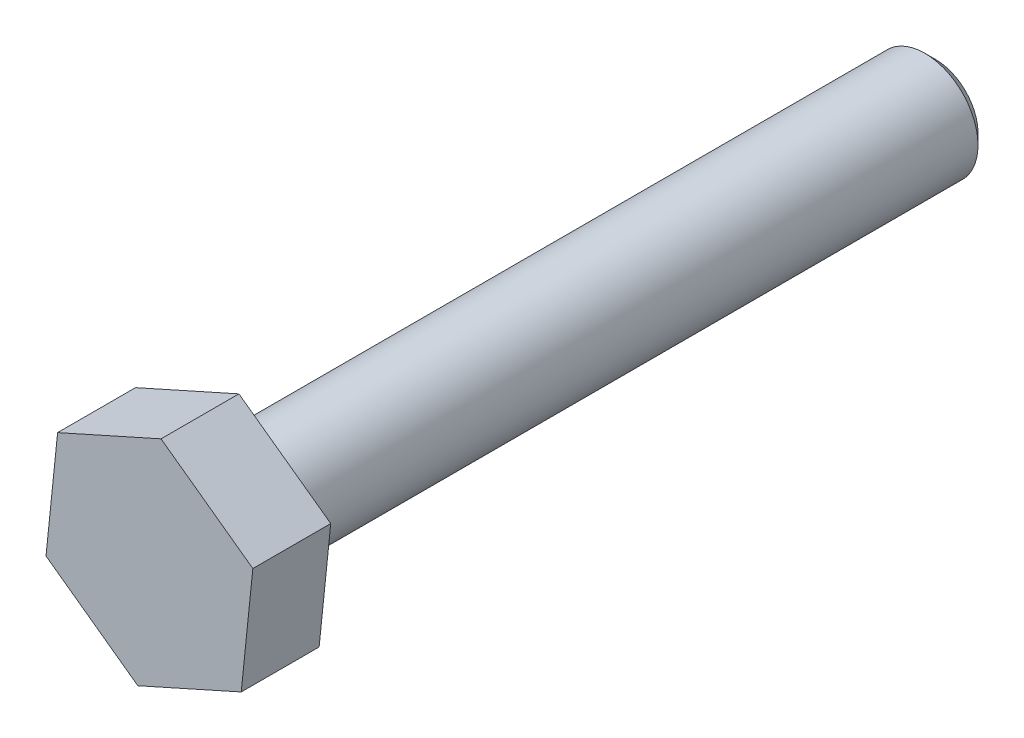
ISO-10303-21;
HEADER;
FILE_DESCRIPTION(('STEP AP214'),'2;1');
FILE_NAME('part.step','',(''),(''),'','','');
FILE_SCHEMA(('AUTOMOTIVE_DESIGN { 1 0 10303 214 1 1 1 1 }'));
ENDSEC;
DATA;
#1=APPLICATION_CONTEXT('core data for automotive mechanical design processes');
#2=APPLICATION_PROTOCOL_DEFINITION('international standard','automotive_design',2000,#1);
#3=PRODUCT_CONTEXT('',#1,'mechanical');
#4=PRODUCT('Part','Part','',(#3));
#5=PRODUCT_RELATED_PRODUCT_CATEGORY('part','',(#4));
#6=PRODUCT_DEFINITION_FORMATION('','',#4);
#7=PRODUCT_DEFINITION_CONTEXT('part definition',#1,'design');
#8=PRODUCT_DEFINITION('design','',#6,#7);
#9=PRODUCT_DEFINITION_SHAPE('','',#8);
#10=(LENGTH_UNIT() NAMED_UNIT(*) SI_UNIT(.MILLI.,.METRE.));
#11=(NAMED_UNIT(*) PLANE_ANGLE_UNIT() SI_UNIT($,.RADIAN.));
#12=(NAMED_UNIT(*) SI_UNIT($,.STERADIAN.) SOLID_ANGLE_UNIT());
#13=UNCERTAINTY_MEASURE_WITH_UNIT(LENGTH_MEASURE(1.E-05),#10,'distance_accuracy_value','');
#14=(GEOMETRIC_REPRESENTATION_CONTEXT(3) GLOBAL_UNCERTAINTY_ASSIGNED_CONTEXT((#13)) GLOBAL_UNIT_ASSIGNED_CONTEXT((#10,
#11,#12)) REPRESENTATION_CONTEXT('',''));
#15=CARTESIAN_POINT('',(0.,0.,0.));
#16=DIRECTION('',(0.,0.,1.));
#17=DIRECTION('',(1.,0.,0.));
#18=AXIS2_PLACEMENT_3D('',#15,#16,#17);
#19=CARTESIAN_POINT('',(0.,0.,0.));
#20=DIRECTION('',(0.,0.,1.));
#21=DIRECTION('',(1.,0.,0.));
#22=AXIS2_PLACEMENT_3D('',#19,#20,#21);
#23=PLANE('',#22);
#24=DIRECTION('',(0.912698102583248,0.408634523187822,0.));
#25=VECTOR('',#24,1.);
#26=CARTESIAN_POINT('',(-0.327875754712407,-3.18315841413395,0.));
#27=LINE('',#26,#25);
#28=CARTESIAN_POINT('',(-0.327875754712407,-3.18315841413395,0.));
#29=VERTEX_POINT('',#28);
#30=CARTESIAN_POINT('',(2.59275817355398,-1.87552793993292,0.));
#31=VERTEX_POINT('',#30);
#32=EDGE_CURVE('E124',#29,#31,#27,.T.);
#33=ORIENTED_EDGE('',*,*,#32,.F.);
#34=DIRECTION('',(0.810236929235619,-0.586102481229038,0.));
#35=VECTOR('',#34,1.);
#36=CARTESIAN_POINT('',(-2.92063392826639,-1.30763047420103,0.));
#37=LINE('',#36,#35);
#38=CARTESIAN_POINT('',(-2.92063392826639,-1.30763047420103,0.));
#39=VERTEX_POINT('',#38);
#40=EDGE_CURVE('E84',#39,#29,#37,.T.);
#41=ORIENTED_EDGE('',*,*,#40,.F.);
#42=DIRECTION('',(-0.102461173347629,-0.99473700441686,0.));
#43=VECTOR('',#42,1.);
#44=CARTESIAN_POINT('',(-2.59275817355398,1.87552793993292,0.));
#45=LINE('',#44,#43);
#46=CARTESIAN_POINT('',(-2.59275817355398,1.87552793993292,0.));
#47=VERTEX_POINT('',#46);
#48=EDGE_CURVE('E78',#47,#39,#45,.T.);
#49=ORIENTED_EDGE('',*,*,#48,.F.);
#50=DIRECTION('',(-0.912698102583248,-0.408634523187822,0.));
#51=VECTOR('',#50,1.);
#52=CARTESIAN_POINT('',(0.327875754712414,3.18315841413395,0.));
#53=LINE('',#52,#51);
#54=CARTESIAN_POINT('',(0.327875754712414,3.18315841413395,0.));
#55=VERTEX_POINT('',#54);
#56=EDGE_CURVE('E114',#55,#47,#53,.T.);
#57=ORIENTED_EDGE('',*,*,#56,.F.);
#58=DIRECTION('',(-0.810236929235619,0.586102481229037,0.));
#59=VECTOR('',#58,1.);
#60=CARTESIAN_POINT('',(2.92063392826639,1.30763047420103,0.));
#61=LINE('',#60,#59);
#62=CARTESIAN_POINT('',(2.92063392826639,1.30763047420103,0.));
#63=VERTEX_POINT('',#62);
#64=EDGE_CURVE('E129',#63,#55,#61,.T.);
#65=ORIENTED_EDGE('',*,*,#64,.F.);
#66=DIRECTION('',(0.102461173347629,0.99473700441686,0.));
#67=VECTOR('',#66,1.);
#68=CARTESIAN_POINT('',(2.59275817355398,-1.87552793993292,0.));
#69=LINE('',#68,#67);
#70=EDGE_CURVE('E127',#31,#63,#69,.T.);
#71=ORIENTED_EDGE('',*,*,#70,.F.);
#72=EDGE_LOOP('',(#33,#41,#49,#57,#65,#71));
#73=FACE_BOUND('',#72,.T.);
#74=CARTESIAN_POINT('',(0.,0.,0.));
#75=DIRECTION('',(0.,0.,1.));
#76=DIRECTION('',(1.,0.,0.));
#77=AXIS2_PLACEMENT_3D('',#74,#75,#76);
#78=CIRCLE('',#77,1.5);
#79=CARTESIAN_POINT('',(1.5,0.,0.));
#80=VERTEX_POINT('',#79);
#81=EDGE_CURVE('E143',#80,#80,#78,.F.);
#82=ORIENTED_EDGE('',*,*,#81,.F.);
#83=EDGE_LOOP('',(#82));
#84=FACE_BOUND('',#83,.T.);
#85=ADVANCED_FACE('F38',(#73,#84),#23,.F.);
#86=CARTESIAN_POINT('',(-0.327875754712407,-3.18315841413395,2.2));
#87=DIRECTION('',(-0.408634523187822,0.912698102583248,0.));
#88=DIRECTION('',(-0.912698102583248,-0.408634523187822,0.));
#89=AXIS2_PLACEMENT_3D('',#86,#87,#88);
#90=PLANE('',#89);
#91=ORIENTED_EDGE('',*,*,#32,.T.);
#92=DIRECTION('',(0.,0.,-1.));
#93=VECTOR('',#92,1.);
#94=CARTESIAN_POINT('',(2.59275817355398,-1.87552793993292,2.2));
#95=LINE('',#94,#93);
#96=CARTESIAN_POINT('',(2.59275817355398,-1.87552793993292,2.2));
#97=VERTEX_POINT('',#96);
#98=EDGE_CURVE('E141',#97,#31,#95,.T.);
#99=ORIENTED_EDGE('',*,*,#98,.F.);
#100=DIRECTION('',(0.912698102583248,0.408634523187822,0.));
#101=VECTOR('',#100,1.);
#102=CARTESIAN_POINT('',(-0.327875754712407,-3.18315841413395,2.2));
#103=LINE('',#102,#101);
#104=CARTESIAN_POINT('',(-0.327875754712407,-3.18315841413395,2.2));
#105=VERTEX_POINT('',#104);
#106=EDGE_CURVE('E134',#105,#97,#103,.T.);
#107=ORIENTED_EDGE('',*,*,#106,.F.);
#108=DIRECTION('',(0.,0.,-1.));
#109=VECTOR('',#108,1.);
#110=CARTESIAN_POINT('',(-0.327875754712407,-3.18315841413395,2.2));
#111=LINE('',#110,#109);
#112=EDGE_CURVE('E120',#105,#29,#111,.T.);
#113=ORIENTED_EDGE('',*,*,#112,.T.);
#114=EDGE_LOOP('',(#91,#99,#107,#113));
#115=FACE_BOUND('',#114,.T.);
#116=ADVANCED_FACE('F159',(#115),#90,.F.);
#117=CARTESIAN_POINT('',(2.59275817355398,-1.87552793993292,2.2));
#118=DIRECTION('',(-0.994737004416859,0.102461173347629,0.));
#119=DIRECTION('',(-0.102461173347629,-0.99473700441686,0.));
#120=AXIS2_PLACEMENT_3D('',#117,#118,#119);
#121=PLANE('',#120);
#122=ORIENTED_EDGE('',*,*,#70,.T.);
#123=DIRECTION('',(0.,0.,-1.));
#124=VECTOR('',#123,1.);
#125=CARTESIAN_POINT('',(2.92063392826639,1.30763047420103,2.2));
#126=LINE('',#125,#124);
#127=CARTESIAN_POINT('',(2.92063392826639,1.30763047420103,2.2));
#128=VERTEX_POINT('',#127);
#129=EDGE_CURVE('E138',#128,#63,#126,.T.);
#130=ORIENTED_EDGE('',*,*,#129,.F.);
#131=DIRECTION('',(0.102461173347629,0.99473700441686,0.));
#132=VECTOR('',#131,1.);
#133=CARTESIAN_POINT('',(2.59275817355398,-1.87552793993292,2.2));
#134=LINE('',#133,#132);
#135=EDGE_CURVE('E93',#97,#128,#134,.T.);
#136=ORIENTED_EDGE('',*,*,#135,.F.);
#137=ORIENTED_EDGE('',*,*,#98,.T.);
#138=EDGE_LOOP('',(#122,#130,#136,#137));
#139=FACE_BOUND('',#138,.T.);
#140=ADVANCED_FACE('F165',(#139),#121,.F.);
#141=CARTESIAN_POINT('',(2.92063392826639,1.30763047420103,2.2));
#142=DIRECTION('',(-0.586102481229037,-0.810236929235619,0.));
#143=DIRECTION('',(0.81023692923562,-0.586102481229037,0.));
#144=AXIS2_PLACEMENT_3D('',#141,#142,#143);
#145=PLANE('',#144);
#146=ORIENTED_EDGE('',*,*,#64,.T.);
#147=DIRECTION('',(0.,0.,-1.));
#148=VECTOR('',#147,1.);
#149=CARTESIAN_POINT('',(0.327875754712414,3.18315841413395,2.2));
#150=LINE('',#149,#148);
#151=CARTESIAN_POINT('',(0.327875754712414,3.18315841413395,2.2));
#152=VERTEX_POINT('',#151);
#153=EDGE_CURVE('E115',#152,#55,#150,.T.);
#154=ORIENTED_EDGE('',*,*,#153,.F.);
#155=DIRECTION('',(-0.810236929235619,0.586102481229037,0.));
#156=VECTOR('',#155,1.);
#157=CARTESIAN_POINT('',(2.92063392826639,1.30763047420103,2.2));
#158=LINE('',#157,#156);
#159=EDGE_CURVE('E106',#128,#152,#158,.T.);
#160=ORIENTED_EDGE('',*,*,#159,.F.);
#161=ORIENTED_EDGE('',*,*,#129,.T.);
#162=EDGE_LOOP('',(#146,#154,#160,#161));
#163=FACE_BOUND('',#162,.T.);
#164=ADVANCED_FACE('F179',(#163),#145,.F.);
#165=CARTESIAN_POINT('',(0.327875754712414,3.18315841413395,2.2));
#166=DIRECTION('',(0.408634523187822,-0.912698102583248,0.));
#167=DIRECTION('',(0.912698102583248,0.408634523187822,0.));
#168=AXIS2_PLACEMENT_3D('',#165,#166,#167);
#169=PLANE('',#168);
#170=ORIENTED_EDGE('',*,*,#56,.T.);
#171=DIRECTION('',(0.,0.,-1.));
#172=VECTOR('',#171,1.);
#173=CARTESIAN_POINT('',(-2.59275817355398,1.87552793993292,2.2));
#174=LINE('',#173,#172);
#175=CARTESIAN_POINT('',(-2.59275817355398,1.87552793993292,2.2));
#176=VERTEX_POINT('',#175);
#177=EDGE_CURVE('E111',#176,#47,#174,.T.);
#178=ORIENTED_EDGE('',*,*,#177,.F.);
#179=DIRECTION('',(-0.912698102583248,-0.408634523187822,0.));
#180=VECTOR('',#179,1.);
#181=CARTESIAN_POINT('',(0.327875754712414,3.18315841413395,2.2));
#182=LINE('',#181,#180);
#183=EDGE_CURVE('E100',#152,#176,#182,.T.);
#184=ORIENTED_EDGE('',*,*,#183,.F.);
#185=ORIENTED_EDGE('',*,*,#153,.T.);
#186=EDGE_LOOP('',(#170,#178,#184,#185));
#187=FACE_BOUND('',#186,.T.);
#188=ADVANCED_FACE('F112',(#187),#169,.F.);
#189=CARTESIAN_POINT('',(-2.59275817355398,1.87552793993292,2.2));
#190=DIRECTION('',(0.994737004416859,-0.102461173347629,0.));
#191=DIRECTION('',(0.102461173347629,0.99473700441686,0.));
#192=AXIS2_PLACEMENT_3D('',#189,#190,#191);
#193=PLANE('',#192);
#194=ORIENTED_EDGE('',*,*,#48,.T.);
#195=DIRECTION('',(0.,0.,-1.));
#196=VECTOR('',#195,1.);
#197=CARTESIAN_POINT('',(-2.92063392826639,-1.30763047420103,2.2));
#198=LINE('',#197,#196);
#199=CARTESIAN_POINT('',(-2.92063392826639,-1.30763047420103,2.2));
#200=VERTEX_POINT('',#199);
#201=EDGE_CURVE('E116',#200,#39,#198,.T.);
#202=ORIENTED_EDGE('',*,*,#201,.F.);
#203=DIRECTION('',(-0.102461173347629,-0.99473700441686,0.));
#204=VECTOR('',#203,1.);
#205=CARTESIAN_POINT('',(-2.59275817355398,1.87552793993292,2.2));
#206=LINE('',#205,#204);
#207=EDGE_CURVE('E104',#176,#200,#206,.T.);
#208=ORIENTED_EDGE('',*,*,#207,.F.);
#209=ORIENTED_EDGE('',*,*,#177,.T.);
#210=EDGE_LOOP('',(#194,#202,#208,#209));
#211=FACE_BOUND('',#210,.T.);
#212=ADVANCED_FACE('F118',(#211),#193,.F.);
#213=CARTESIAN_POINT('',(-2.92063392826639,-1.30763047420103,2.2));
#214=DIRECTION('',(0.586102481229038,0.810236929235619,0.));
#215=DIRECTION('',(-0.810236929235619,0.586102481229038,0.));
#216=AXIS2_PLACEMENT_3D('',#213,#214,#215);
#217=PLANE('',#216);
#218=ORIENTED_EDGE('',*,*,#40,.T.);
#219=ORIENTED_EDGE('',*,*,#112,.F.);
#220=DIRECTION('',(0.810236929235619,-0.586102481229038,0.));
#221=VECTOR('',#220,1.);
#222=CARTESIAN_POINT('',(-2.92063392826639,-1.30763047420103,2.2));
#223=LINE('',#222,#221);
#224=EDGE_CURVE('E55',#200,#105,#223,.T.);
#225=ORIENTED_EDGE('',*,*,#224,.F.);
#226=ORIENTED_EDGE('',*,*,#201,.T.);
#227=EDGE_LOOP('',(#218,#219,#225,#226));
#228=FACE_BOUND('',#227,.T.);
#229=ADVANCED_FACE('F172',(#228),#217,.F.);
#230=CARTESIAN_POINT('',(0.,0.,2.2));
#231=DIRECTION('',(0.,0.,1.));
#232=DIRECTION('',(1.,0.,0.));
#233=AXIS2_PLACEMENT_3D('',#230,#231,#232);
#234=PLANE('',#233);
#235=ORIENTED_EDGE('',*,*,#106,.T.);
#236=ORIENTED_EDGE('',*,*,#135,.T.);
#237=ORIENTED_EDGE('',*,*,#159,.T.);
#238=ORIENTED_EDGE('',*,*,#183,.T.);
#239=ORIENTED_EDGE('',*,*,#207,.T.);
#240=ORIENTED_EDGE('',*,*,#224,.T.);
#241=EDGE_LOOP('',(#235,#236,#237,#238,#239,#240));
#242=FACE_BOUND('',#241,.T.);
#243=ADVANCED_FACE('F102',(#242),#234,.T.);
#244=CARTESIAN_POINT('',(0.,0.,-20.));
#245=DIRECTION('',(0.,0.,1.));
#246=DIRECTION('',(1.,0.,0.));
#247=AXIS2_PLACEMENT_3D('',#244,#245,#246);
#248=CYLINDRICAL_SURFACE('',#247,1.5);
#249=CARTESIAN_POINT('',(0.,0.,-19.7));
#250=DIRECTION('',(0.,0.,-1.));
#251=DIRECTION('',(-1.,0.,0.));
#252=AXIS2_PLACEMENT_3D('',#249,#250,#251);
#253=CIRCLE('',#252,1.5);
#254=CARTESIAN_POINT('',(-1.5,0.,-19.7));
#255=VERTEX_POINT('',#254);
#256=EDGE_CURVE('E11',#255,#255,#253,.F.);
#257=ORIENTED_EDGE('',*,*,#256,.T.);
#258=EDGE_LOOP('',(#257));
#259=FACE_BOUND('',#258,.T.);
#260=ORIENTED_EDGE('',*,*,#81,.T.);
#261=EDGE_LOOP('',(#260));
#262=FACE_BOUND('',#261,.T.);
#263=ADVANCED_FACE('F155',(#259,#262),#248,.T.);
#264=CARTESIAN_POINT('',(0.,0.,-20.));
#265=DIRECTION('',(0.,0.,-1.));
#266=DIRECTION('',(-1.,0.,0.));
#267=AXIS2_PLACEMENT_3D('',#264,#265,#266);
#268=PLANE('',#267);
#269=CARTESIAN_POINT('',(0.,0.,-20.));
#270=DIRECTION('',(0.,0.,-1.));
#271=DIRECTION('',(-1.,0.,0.));
#272=AXIS2_PLACEMENT_3D('',#269,#270,#271);
#273=CIRCLE('',#272,1.2);
#274=CARTESIAN_POINT('',(-1.2,0.,-20.));
#275=VERTEX_POINT('',#274);
#276=EDGE_CURVE('E47',#275,#275,#273,.T.);
#277=ORIENTED_EDGE('',*,*,#276,.T.);
#278=EDGE_LOOP('',(#277));
#279=FACE_BOUND('',#278,.T.);
#280=ADVANCED_FACE('F148',(#279),#268,.T.);
#281=CARTESIAN_POINT('',(0.,0.,-20.));
#282=DIRECTION('',(0.,0.,1.));
#283=DIRECTION('',(1.,0.,0.));
#284=AXIS2_PLACEMENT_3D('',#281,#282,#283);
#285=CONICAL_SURFACE('',#284,1.2,0.785398163397452);
#286=ORIENTED_EDGE('',*,*,#256,.F.);
#287=EDGE_LOOP('',(#286));
#288=FACE_BOUND('',#287,.T.);
#289=ORIENTED_EDGE('',*,*,#276,.F.);
#290=EDGE_LOOP('',(#289));
#291=FACE_BOUND('',#290,.T.);
#292=ADVANCED_FACE('F40',(#288,#291),#285,.T.);
#293=CLOSED_SHELL('',(#85,#116,#140,#164,#188,#212,#229,#243,#263,#280,#292));
#294=MANIFOLD_SOLID_BREP('B2',#293);
#295=ADVANCED_BREP_SHAPE_REPRESENTATION('',(#18,#294),#14);
#296=SHAPE_DEFINITION_REPRESENTATION(#9,#295);
ENDSEC;
END-ISO-10303-21;
